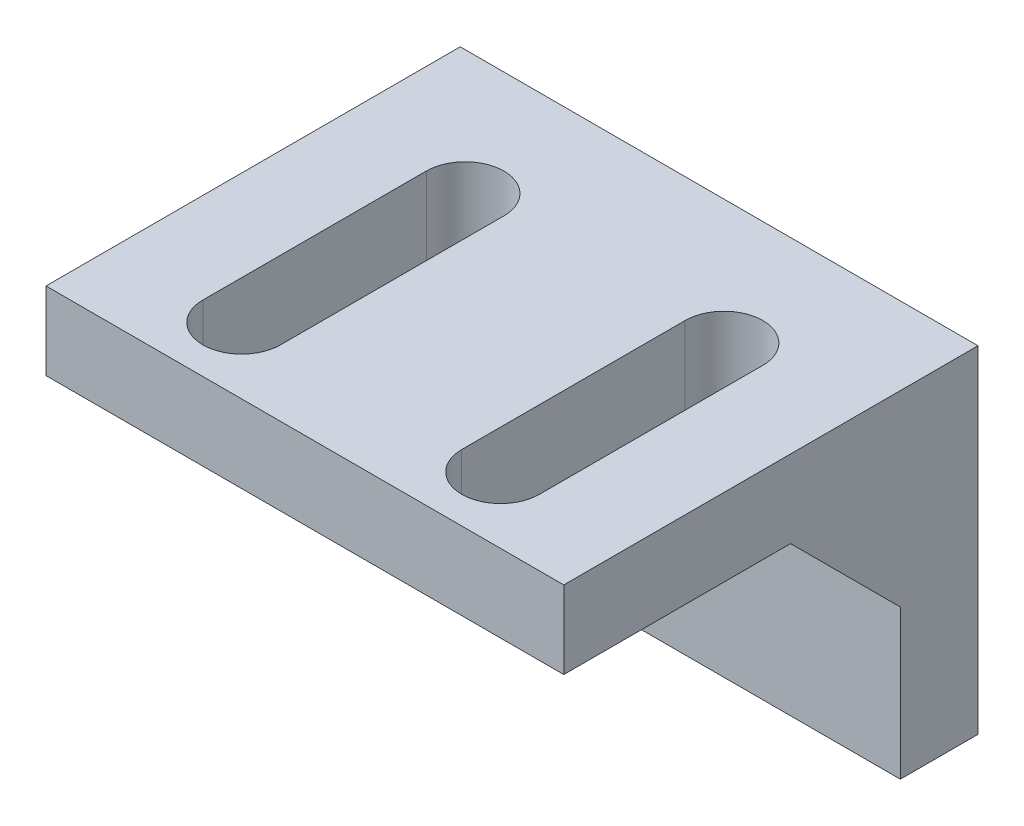
ISO-10303-21;
HEADER;
FILE_DESCRIPTION(('STEP AP214'),'2;1');
FILE_NAME('part.step','',(''),(''),'','','');
FILE_SCHEMA(('AUTOMOTIVE_DESIGN { 1 0 10303 214 1 1 1 1 }'));
ENDSEC;
DATA;
#1=APPLICATION_CONTEXT('core data for automotive mechanical design processes');
#2=APPLICATION_PROTOCOL_DEFINITION('international standard','automotive_design',2000,#1);
#3=PRODUCT_CONTEXT('',#1,'mechanical');
#4=PRODUCT('Part','Part','',(#3));
#5=PRODUCT_RELATED_PRODUCT_CATEGORY('part','',(#4));
#6=PRODUCT_DEFINITION_FORMATION('','',#4);
#7=PRODUCT_DEFINITION_CONTEXT('part definition',#1,'design');
#8=PRODUCT_DEFINITION('design','',#6,#7);
#9=PRODUCT_DEFINITION_SHAPE('','',#8);
#10=(LENGTH_UNIT() NAMED_UNIT(*) SI_UNIT(.MILLI.,.METRE.));
#11=(NAMED_UNIT(*) PLANE_ANGLE_UNIT() SI_UNIT($,.RADIAN.));
#12=(NAMED_UNIT(*) SI_UNIT($,.STERADIAN.) SOLID_ANGLE_UNIT());
#13=UNCERTAINTY_MEASURE_WITH_UNIT(LENGTH_MEASURE(1.E-05),#10,'distance_accuracy_value','');
#14=(GEOMETRIC_REPRESENTATION_CONTEXT(3) GLOBAL_UNCERTAINTY_ASSIGNED_CONTEXT((#13)) GLOBAL_UNIT_ASSIGNED_CONTEXT((#10,
#11,#12)) REPRESENTATION_CONTEXT('',''));
#15=CARTESIAN_POINT('',(0.,0.,0.));
#16=DIRECTION('',(0.,0.,1.));
#17=DIRECTION('',(1.,0.,0.));
#18=AXIS2_PLACEMENT_3D('',#15,#16,#17);
#19=CARTESIAN_POINT('',(14.8868315031985,-23.5550000000421,16.));
#20=DIRECTION('',(0.,1.,0.));
#21=DIRECTION('',(0.,0.,1.));
#22=AXIS2_PLACEMENT_3D('',#19,#20,#21);
#23=PLANE('',#22);
#24=DIRECTION('',(-1.,0.,0.));
#25=VECTOR('',#24,1.);
#26=CARTESIAN_POINT('',(17.8868315031985,-23.5550000000421,7.23913251133836));
#27=LINE('',#26,#25);
#28=CARTESIAN_POINT('',(17.8868315031985,-23.5550000000421,7.23913251133836));
#29=VERTEX_POINT('',#28);
#30=CARTESIAN_POINT('',(14.8868315031985,-23.5550000000421,7.23913251133836));
#31=VERTEX_POINT('',#30);
#32=EDGE_CURVE('E210',#29,#31,#27,.T.);
#33=ORIENTED_EDGE('',*,*,#32,.F.);
#34=DIRECTION('',(0.,-2.99782274259685E-10,1.));
#35=VECTOR('',#34,1.);
#36=CARTESIAN_POINT('',(17.8868315031985,-23.5549999987713,3.));
#37=LINE('',#36,#35);
#38=CARTESIAN_POINT('',(17.8868315031985,-23.5550000000421,3.));
#39=VERTEX_POINT('',#38);
#40=EDGE_CURVE('E198',#39,#29,#37,.T.);
#41=ORIENTED_EDGE('',*,*,#40,.F.);
#42=DIRECTION('',(1.,0.,0.));
#43=VECTOR('',#42,1.);
#44=CARTESIAN_POINT('',(14.8868315031985,-23.5550000000421,3.));
#45=LINE('',#44,#43);
#46=CARTESIAN_POINT('',(31.8868315031985,-23.5549999987713,3.));
#47=VERTEX_POINT('',#46);
#48=EDGE_CURVE('E260',#39,#47,#45,.T.);
#49=ORIENTED_EDGE('',*,*,#48,.T.);
#50=DIRECTION('',(0.,-2.99782274259685E-10,1.));
#51=VECTOR('',#50,1.);
#52=CARTESIAN_POINT('',(31.8868315031985,-23.5549999987713,3.));
#53=LINE('',#52,#51);
#54=CARTESIAN_POINT('',(31.8868315031985,-23.5550000000421,7.23913251133836));
#55=VERTEX_POINT('',#54);
#56=EDGE_CURVE('E247',#47,#55,#53,.T.);
#57=ORIENTED_EDGE('',*,*,#56,.T.);
#58=DIRECTION('',(1.,0.,0.));
#59=VECTOR('',#58,1.);
#60=CARTESIAN_POINT('',(31.8868315031985,-23.5550000000421,7.23913251133836));
#61=LINE('',#60,#59);
#62=CARTESIAN_POINT('',(34.8868315031985,-23.5550000000421,7.23913251133836));
#63=VERTEX_POINT('',#62);
#64=EDGE_CURVE('E255',#55,#63,#61,.T.);
#65=ORIENTED_EDGE('',*,*,#64,.T.);
#66=DIRECTION('',(0.,0.,-1.));
#67=VECTOR('',#66,1.);
#68=CARTESIAN_POINT('',(34.8868315031985,-23.5550000000421,16.));
#69=LINE('',#68,#67);
#70=CARTESIAN_POINT('',(34.8868315031985,-23.5550000000421,16.));
#71=VERTEX_POINT('',#70);
#72=EDGE_CURVE('E274',#71,#63,#69,.T.);
#73=ORIENTED_EDGE('',*,*,#72,.F.);
#74=DIRECTION('',(1.,0.,0.));
#75=VECTOR('',#74,1.);
#76=CARTESIAN_POINT('',(14.8868315031985,-23.5550000000421,16.));
#77=LINE('',#76,#75);
#78=CARTESIAN_POINT('',(14.8868315031985,-23.5550000000421,16.));
#79=VERTEX_POINT('',#78);
#80=EDGE_CURVE('E266',#79,#71,#77,.T.);
#81=ORIENTED_EDGE('',*,*,#80,.F.);
#82=DIRECTION('',(0.,0.,-1.));
#83=VECTOR('',#82,1.);
#84=CARTESIAN_POINT('',(14.8868315031985,-23.5550000000421,16.));
#85=LINE('',#84,#83);
#86=EDGE_CURVE('E292',#79,#31,#85,.T.);
#87=ORIENTED_EDGE('',*,*,#86,.T.);
#88=EDGE_LOOP('',(#33,#41,#49,#57,#65,#73,#81,#87));
#89=FACE_BOUND('',#88,.T.);
#90=CARTESIAN_POINT('',(29.8868315031985,-23.5550000000421,13.4411604619242));
#91=DIRECTION('',(0.,-1.,0.));
#92=DIRECTION('',(0.,0.,-1.));
#93=AXIS2_PLACEMENT_3D('',#90,#91,#92);
#94=CIRCLE('',#93,1.5);
#95=CARTESIAN_POINT('',(31.3868315031985,-23.5550000000421,13.4411604619242));
#96=VERTEX_POINT('',#95);
#97=CARTESIAN_POINT('',(28.3868315031985,-23.5550000000421,13.4411604619242));
#98=VERTEX_POINT('',#97);
#99=EDGE_CURVE('E230',#96,#98,#94,.T.);
#100=ORIENTED_EDGE('',*,*,#99,.F.);
#101=DIRECTION('',(0.,0.,1.));
#102=VECTOR('',#101,1.);
#103=CARTESIAN_POINT('',(31.3868315031985,-23.5550000000421,4.81211077924535));
#104=LINE('',#103,#102);
#105=CARTESIAN_POINT('',(31.3868315031985,-23.5550000000421,4.81211077924535));
#106=VERTEX_POINT('',#105);
#107=EDGE_CURVE('E213',#106,#96,#104,.T.);
#108=ORIENTED_EDGE('',*,*,#107,.F.);
#109=CARTESIAN_POINT('',(29.8868315031985,-23.5550000000421,4.81211077924535));
#110=DIRECTION('',(0.,-1.,0.));
#111=DIRECTION('',(0.,0.,-1.));
#112=AXIS2_PLACEMENT_3D('',#109,#110,#111);
#113=CIRCLE('',#112,1.5);
#114=CARTESIAN_POINT('',(28.3868315031985,-23.5550000000421,4.81211077924535));
#115=VERTEX_POINT('',#114);
#116=EDGE_CURVE('E219',#115,#106,#113,.T.);
#117=ORIENTED_EDGE('',*,*,#116,.F.);
#118=DIRECTION('',(0.,0.,1.));
#119=VECTOR('',#118,1.);
#120=CARTESIAN_POINT('',(28.3868315031985,-23.5550000000421,4.81211077924535));
#121=LINE('',#120,#119);
#122=EDGE_CURVE('E233',#115,#98,#121,.T.);
#123=ORIENTED_EDGE('',*,*,#122,.T.);
#124=EDGE_LOOP('',(#100,#108,#117,#123));
#125=FACE_BOUND('',#124,.T.);
#126=DIRECTION('',(0.,0.,1.));
#127=VECTOR('',#126,1.);
#128=CARTESIAN_POINT('',(18.3868315031985,-23.5550000000421,4.81211077924535));
#129=LINE('',#128,#127);
#130=CARTESIAN_POINT('',(18.3868315031985,-23.5550000000421,4.81211077924535));
#131=VERTEX_POINT('',#130);
#132=CARTESIAN_POINT('',(18.3868315031985,-23.5550000000421,13.4411604619242));
#133=VERTEX_POINT('',#132);
#134=EDGE_CURVE('E51',#131,#133,#129,.T.);
#135=ORIENTED_EDGE('',*,*,#134,.T.);
#136=CARTESIAN_POINT('',(19.8868315031985,-23.5550000000421,13.4411604619242));
#137=DIRECTION('',(0.,1.,0.));
#138=DIRECTION('',(0.,0.,-1.));
#139=AXIS2_PLACEMENT_3D('',#136,#137,#138);
#140=CIRCLE('',#139,1.5);
#141=CARTESIAN_POINT('',(21.3868315031985,-23.5550000000421,13.4411604619242));
#142=VERTEX_POINT('',#141);
#143=EDGE_CURVE('E179',#133,#142,#140,.T.);
#144=ORIENTED_EDGE('',*,*,#143,.T.);
#145=DIRECTION('',(0.,0.,1.));
#146=VECTOR('',#145,1.);
#147=CARTESIAN_POINT('',(21.3868315031985,-23.5550000000421,4.81211077924535));
#148=LINE('',#147,#146);
#149=CARTESIAN_POINT('',(21.3868315031985,-23.5550000000421,4.81211077924535));
#150=VERTEX_POINT('',#149);
#151=EDGE_CURVE('E182',#150,#142,#148,.T.);
#152=ORIENTED_EDGE('',*,*,#151,.F.);
#153=CARTESIAN_POINT('',(19.8868315031985,-23.5550000000421,4.81211077924535));
#154=DIRECTION('',(0.,1.,0.));
#155=DIRECTION('',(0.,0.,-1.));
#156=AXIS2_PLACEMENT_3D('',#153,#154,#155);
#157=CIRCLE('',#156,1.5);
#158=EDGE_CURVE('E188',#150,#131,#157,.T.);
#159=ORIENTED_EDGE('',*,*,#158,.T.);
#160=EDGE_LOOP('',(#135,#144,#152,#159));
#161=FACE_BOUND('',#160,.T.);
#162=ADVANCED_FACE('F33',(#89,#125,#161),#23,.F.);
#163=CARTESIAN_POINT('',(14.8868315031985,-20.5550000000421,3.));
#164=DIRECTION('',(0.,1.,0.));
#165=DIRECTION('',(0.,0.,1.));
#166=AXIS2_PLACEMENT_3D('',#163,#164,#165);
#167=PLANE('',#166);
#168=DIRECTION('',(1.,0.,0.));
#169=VECTOR('',#168,1.);
#170=CARTESIAN_POINT('',(14.8868315031985,-20.5550000000421,0.));
#171=LINE('',#170,#169);
#172=CARTESIAN_POINT('',(14.8868315031985,-20.5550000000421,0.));
#173=VERTEX_POINT('',#172);
#174=CARTESIAN_POINT('',(34.8868315031985,-20.5550000000421,0.));
#175=VERTEX_POINT('',#174);
#176=EDGE_CURVE('E298',#173,#175,#171,.T.);
#177=ORIENTED_EDGE('',*,*,#176,.F.);
#178=DIRECTION('',(0.,0.,-1.));
#179=VECTOR('',#178,1.);
#180=CARTESIAN_POINT('',(14.8868315031985,-20.5550000000421,3.));
#181=LINE('',#180,#179);
#182=CARTESIAN_POINT('',(14.8868315031985,-20.5550000000421,16.));
#183=VERTEX_POINT('',#182);
#184=EDGE_CURVE('E282',#183,#173,#181,.T.);
#185=ORIENTED_EDGE('',*,*,#184,.F.);
#186=DIRECTION('',(-1.,0.,0.));
#187=VECTOR('',#186,1.);
#188=CARTESIAN_POINT('',(14.8868315031985,-20.5550000000421,16.));
#189=LINE('',#188,#187);
#190=CARTESIAN_POINT('',(34.8868315031985,-20.5550000000421,16.));
#191=VERTEX_POINT('',#190);
#192=EDGE_CURVE('E271',#191,#183,#189,.T.);
#193=ORIENTED_EDGE('',*,*,#192,.F.);
#194=DIRECTION('',(0.,0.,-1.));
#195=VECTOR('',#194,1.);
#196=CARTESIAN_POINT('',(34.8868315031985,-20.5550000000421,3.));
#197=LINE('',#196,#195);
#198=EDGE_CURVE('E302',#191,#175,#197,.T.);
#199=ORIENTED_EDGE('',*,*,#198,.T.);
#200=EDGE_LOOP('',(#177,#185,#193,#199));
#201=FACE_BOUND('',#200,.T.);
#202=DIRECTION('',(0.,0.,1.));
#203=VECTOR('',#202,1.);
#204=CARTESIAN_POINT('',(31.3868315031985,-20.5550000000421,4.81211077924535));
#205=LINE('',#204,#203);
#206=CARTESIAN_POINT('',(31.3868315031985,-20.5550000000421,4.81211077924535));
#207=VERTEX_POINT('',#206);
#208=CARTESIAN_POINT('',(31.3868315031985,-20.5550000000421,13.4411604619242));
#209=VERTEX_POINT('',#208);
#210=EDGE_CURVE('E215',#207,#209,#205,.T.);
#211=ORIENTED_EDGE('',*,*,#210,.T.);
#212=CARTESIAN_POINT('',(29.8868315031985,-20.5550000000421,13.4411604619242));
#213=DIRECTION('',(0.,-1.,0.));
#214=DIRECTION('',(0.,0.,-1.));
#215=AXIS2_PLACEMENT_3D('',#212,#213,#214);
#216=CIRCLE('',#215,1.5);
#217=CARTESIAN_POINT('',(28.3868315031985,-20.5550000000421,13.4411604619242));
#218=VERTEX_POINT('',#217);
#219=EDGE_CURVE('E218',#209,#218,#216,.T.);
#220=ORIENTED_EDGE('',*,*,#219,.T.);
#221=DIRECTION('',(0.,0.,1.));
#222=VECTOR('',#221,1.);
#223=CARTESIAN_POINT('',(28.3868315031985,-20.5550000000421,4.81211077924535));
#224=LINE('',#223,#222);
#225=CARTESIAN_POINT('',(28.3868315031985,-20.5550000000421,4.81211077924535));
#226=VERTEX_POINT('',#225);
#227=EDGE_CURVE('E222',#226,#218,#224,.T.);
#228=ORIENTED_EDGE('',*,*,#227,.F.);
#229=CARTESIAN_POINT('',(29.8868315031985,-20.5550000000421,4.81211077924535));
#230=DIRECTION('',(0.,-1.,0.));
#231=DIRECTION('',(0.,0.,-1.));
#232=AXIS2_PLACEMENT_3D('',#229,#230,#231);
#233=CIRCLE('',#232,1.5);
#234=EDGE_CURVE('E225',#226,#207,#233,.T.);
#235=ORIENTED_EDGE('',*,*,#234,.T.);
#236=EDGE_LOOP('',(#211,#220,#228,#235));
#237=FACE_BOUND('',#236,.T.);
#238=CARTESIAN_POINT('',(19.8868315031985,-20.5550000000421,13.4411604619242));
#239=DIRECTION('',(0.,1.,0.));
#240=DIRECTION('',(0.,0.,-1.));
#241=AXIS2_PLACEMENT_3D('',#238,#239,#240);
#242=CIRCLE('',#241,1.5);
#243=CARTESIAN_POINT('',(18.3868315031985,-20.5550000000421,13.4411604619242));
#244=VERTEX_POINT('',#243);
#245=CARTESIAN_POINT('',(21.3868315031985,-20.5550000000421,13.4411604619242));
#246=VERTEX_POINT('',#245);
#247=EDGE_CURVE('E175',#244,#246,#242,.T.);
#248=ORIENTED_EDGE('',*,*,#247,.F.);
#249=DIRECTION('',(0.,0.,1.));
#250=VECTOR('',#249,1.);
#251=CARTESIAN_POINT('',(18.3868315031985,-20.5550000000421,4.81211077924535));
#252=LINE('',#251,#250);
#253=CARTESIAN_POINT('',(18.3868315031985,-20.5550000000421,4.81211077924535));
#254=VERTEX_POINT('',#253);
#255=EDGE_CURVE('E171',#254,#244,#252,.T.);
#256=ORIENTED_EDGE('',*,*,#255,.F.);
#257=CARTESIAN_POINT('',(19.8868315031985,-20.5550000000421,4.81211077924535));
#258=DIRECTION('',(0.,1.,0.));
#259=DIRECTION('',(0.,0.,-1.));
#260=AXIS2_PLACEMENT_3D('',#257,#258,#259);
#261=CIRCLE('',#260,1.5);
#262=CARTESIAN_POINT('',(21.3868315031985,-20.5550000000421,4.81211077924535));
#263=VERTEX_POINT('',#262);
#264=EDGE_CURVE('E163',#263,#254,#261,.T.);
#265=ORIENTED_EDGE('',*,*,#264,.F.);
#266=DIRECTION('',(0.,0.,1.));
#267=VECTOR('',#266,1.);
#268=CARTESIAN_POINT('',(21.3868315031985,-20.5550000000421,4.81211077924535));
#269=LINE('',#268,#267);
#270=EDGE_CURVE('E59',#263,#246,#269,.T.);
#271=ORIENTED_EDGE('',*,*,#270,.T.);
#272=EDGE_LOOP('',(#248,#256,#265,#271));
#273=FACE_BOUND('',#272,.T.);
#274=ADVANCED_FACE('F178',(#201,#237,#273),#167,.T.);
#275=CARTESIAN_POINT('',(0.,0.,3.));
#276=DIRECTION('',(0.,0.,1.));
#277=DIRECTION('',(1.,0.,0.));
#278=AXIS2_PLACEMENT_3D('',#275,#276,#277);
#279=PLANE('',#278);
#280=DIRECTION('',(0.,1.,0.));
#281=VECTOR('',#280,1.);
#282=CARTESIAN_POINT('',(17.8868315031985,-27.7941325101097,3.));
#283=LINE('',#282,#281);
#284=CARTESIAN_POINT('',(17.8868315031985,-27.7941325101097,3.));
#285=VERTEX_POINT('',#284);
#286=EDGE_CURVE('E201',#285,#39,#283,.T.);
#287=ORIENTED_EDGE('',*,*,#286,.F.);
#288=DIRECTION('',(-1.,0.,0.));
#289=VECTOR('',#288,1.);
#290=CARTESIAN_POINT('',(17.8868315031985,-27.7941325101097,3.));
#291=LINE('',#290,#289);
#292=CARTESIAN_POINT('',(14.8868315031985,-27.7941325101096,3.));
#293=VERTEX_POINT('',#292);
#294=EDGE_CURVE('E207',#285,#293,#291,.T.);
#295=ORIENTED_EDGE('',*,*,#294,.T.);
#296=DIRECTION('',(0.,-1.,0.));
#297=VECTOR('',#296,1.);
#298=CARTESIAN_POINT('',(14.8868315031985,-20.5550000000421,3.));
#299=LINE('',#298,#297);
#300=CARTESIAN_POINT('',(14.8868315031985,-33.5550000000421,3.));
#301=VERTEX_POINT('',#300);
#302=EDGE_CURVE('E37',#293,#301,#299,.T.);
#303=ORIENTED_EDGE('',*,*,#302,.T.);
#304=DIRECTION('',(1.,0.,0.));
#305=VECTOR('',#304,1.);
#306=CARTESIAN_POINT('',(14.8868315031985,-33.5550000000421,3.));
#307=LINE('',#306,#305);
#308=CARTESIAN_POINT('',(34.8868315031985,-33.5550000000421,3.));
#309=VERTEX_POINT('',#308);
#310=EDGE_CURVE('E283',#301,#309,#307,.T.);
#311=ORIENTED_EDGE('',*,*,#310,.T.);
#312=DIRECTION('',(0.,-1.,0.));
#313=VECTOR('',#312,1.);
#314=CARTESIAN_POINT('',(34.8868315031985,-20.5550000000421,3.));
#315=LINE('',#314,#313);
#316=CARTESIAN_POINT('',(34.8868315031985,-27.7941325101096,3.));
#317=VERTEX_POINT('',#316);
#318=EDGE_CURVE('E279',#317,#309,#315,.T.);
#319=ORIENTED_EDGE('',*,*,#318,.F.);
#320=DIRECTION('',(1.,0.,0.));
#321=VECTOR('',#320,1.);
#322=CARTESIAN_POINT('',(31.8868315031985,-27.7941325101096,3.));
#323=LINE('',#322,#321);
#324=CARTESIAN_POINT('',(31.8868315031985,-27.7941325101096,3.));
#325=VERTEX_POINT('',#324);
#326=EDGE_CURVE('E258',#325,#317,#323,.T.);
#327=ORIENTED_EDGE('',*,*,#326,.F.);
#328=DIRECTION('',(0.,1.,0.));
#329=VECTOR('',#328,1.);
#330=CARTESIAN_POINT('',(31.8868315031985,-27.7941325101096,3.));
#331=LINE('',#330,#329);
#332=EDGE_CURVE('E252',#325,#47,#331,.T.);
#333=ORIENTED_EDGE('',*,*,#332,.T.);
#334=ORIENTED_EDGE('',*,*,#48,.F.);
#335=EDGE_LOOP('',(#287,#295,#303,#311,#319,#327,#333,#334));
#336=FACE_BOUND('',#335,.T.);
#337=ADVANCED_FACE('F326',(#336),#279,.T.);
#338=CARTESIAN_POINT('',(14.8868315031985,-20.5550000000421,3.));
#339=DIRECTION('',(1.,0.,0.));
#340=DIRECTION('',(0.,1.,0.));
#341=AXIS2_PLACEMENT_3D('',#338,#339,#340);
#342=PLANE('',#341);
#343=ORIENTED_EDGE('',*,*,#302,.F.);
#344=DIRECTION('',(0.,-0.707106781080558,-0.707106781292537));
#345=VECTOR('',#344,1.);
#346=CARTESIAN_POINT('',(14.8868315031985,-23.5550000000421,7.23913251133836));
#347=LINE('',#346,#345);
#348=EDGE_CURVE('E194',#31,#293,#347,.T.);
#349=ORIENTED_EDGE('',*,*,#348,.F.);
#350=ORIENTED_EDGE('',*,*,#86,.F.);
#351=DIRECTION('',(0.,-1.,0.));
#352=VECTOR('',#351,1.);
#353=CARTESIAN_POINT('',(14.8868315031985,-20.5550000000421,16.));
#354=LINE('',#353,#352);
#355=EDGE_CURVE('E263',#183,#79,#354,.T.);
#356=ORIENTED_EDGE('',*,*,#355,.F.);
#357=ORIENTED_EDGE('',*,*,#184,.T.);
#358=DIRECTION('',(0.,-1.,0.));
#359=VECTOR('',#358,1.);
#360=CARTESIAN_POINT('',(14.8868315031985,-20.5550000000421,0.));
#361=LINE('',#360,#359);
#362=CARTESIAN_POINT('',(14.8868315031985,-33.5550000000421,0.));
#363=VERTEX_POINT('',#362);
#364=EDGE_CURVE('E288',#173,#363,#361,.T.);
#365=ORIENTED_EDGE('',*,*,#364,.T.);
#366=DIRECTION('',(0.,0.,-1.));
#367=VECTOR('',#366,1.);
#368=CARTESIAN_POINT('',(14.8868315031985,-33.5550000000421,3.));
#369=LINE('',#368,#367);
#370=EDGE_CURVE('E11',#301,#363,#369,.T.);
#371=ORIENTED_EDGE('',*,*,#370,.F.);
#372=EDGE_LOOP('',(#343,#349,#350,#356,#357,#365,#371));
#373=FACE_BOUND('',#372,.T.);
#374=ADVANCED_FACE('F35',(#373),#342,.F.);
#375=CARTESIAN_POINT('',(14.8868315031985,-33.5550000000421,3.));
#376=DIRECTION('',(0.,1.,0.));
#377=DIRECTION('',(0.,0.,1.));
#378=AXIS2_PLACEMENT_3D('',#375,#376,#377);
#379=PLANE('',#378);
#380=DIRECTION('',(1.,0.,0.));
#381=VECTOR('',#380,1.);
#382=CARTESIAN_POINT('',(14.8868315031985,-33.5550000000421,0.));
#383=LINE('',#382,#381);
#384=CARTESIAN_POINT('',(34.8868315031985,-33.5550000000421,0.));
#385=VERTEX_POINT('',#384);
#386=EDGE_CURVE('E291',#363,#385,#383,.T.);
#387=ORIENTED_EDGE('',*,*,#386,.T.);
#388=DIRECTION('',(0.,0.,-1.));
#389=VECTOR('',#388,1.);
#390=CARTESIAN_POINT('',(34.8868315031985,-33.5550000000421,3.));
#391=LINE('',#390,#389);
#392=EDGE_CURVE('E43',#309,#385,#391,.T.);
#393=ORIENTED_EDGE('',*,*,#392,.F.);
#394=ORIENTED_EDGE('',*,*,#310,.F.);
#395=ORIENTED_EDGE('',*,*,#370,.T.);
#396=EDGE_LOOP('',(#387,#393,#394,#395));
#397=FACE_BOUND('',#396,.T.);
#398=ADVANCED_FACE('F350',(#397),#379,.F.);
#399=CARTESIAN_POINT('',(34.8868315031985,-20.5550000000421,3.));
#400=DIRECTION('',(1.,0.,0.));
#401=DIRECTION('',(0.,0.,-1.));
#402=AXIS2_PLACEMENT_3D('',#399,#400,#401);
#403=PLANE('',#402);
#404=DIRECTION('',(0.,-0.707106781080558,-0.707106781292537));
#405=VECTOR('',#404,1.);
#406=CARTESIAN_POINT('',(34.8868315031985,-23.5550000000421,7.23913251133836));
#407=LINE('',#406,#405);
#408=EDGE_CURVE('E240',#63,#317,#407,.T.);
#409=ORIENTED_EDGE('',*,*,#408,.T.);
#410=ORIENTED_EDGE('',*,*,#318,.T.);
#411=ORIENTED_EDGE('',*,*,#392,.T.);
#412=DIRECTION('',(0.,-1.,0.));
#413=VECTOR('',#412,1.);
#414=CARTESIAN_POINT('',(34.8868315031985,-20.5550000000421,0.));
#415=LINE('',#414,#413);
#416=EDGE_CURVE('E295',#175,#385,#415,.T.);
#417=ORIENTED_EDGE('',*,*,#416,.F.);
#418=ORIENTED_EDGE('',*,*,#198,.F.);
#419=DIRECTION('',(0.,1.,0.));
#420=VECTOR('',#419,1.);
#421=CARTESIAN_POINT('',(34.8868315031985,-20.5550000000421,16.));
#422=LINE('',#421,#420);
#423=EDGE_CURVE('E268',#71,#191,#422,.T.);
#424=ORIENTED_EDGE('',*,*,#423,.F.);
#425=ORIENTED_EDGE('',*,*,#72,.T.);
#426=EDGE_LOOP('',(#409,#410,#411,#417,#418,#424,#425));
#427=FACE_BOUND('',#426,.T.);
#428=ADVANCED_FACE('F336',(#427),#403,.T.);
#429=CARTESIAN_POINT('',(0.,0.,0.));
#430=DIRECTION('',(0.,0.,1.));
#431=DIRECTION('',(1.,0.,0.));
#432=AXIS2_PLACEMENT_3D('',#429,#430,#431);
#433=PLANE('',#432);
#434=ORIENTED_EDGE('',*,*,#364,.F.);
#435=ORIENTED_EDGE('',*,*,#176,.T.);
#436=ORIENTED_EDGE('',*,*,#416,.T.);
#437=ORIENTED_EDGE('',*,*,#386,.F.);
#438=EDGE_LOOP('',(#434,#435,#436,#437));
#439=FACE_BOUND('',#438,.T.);
#440=ADVANCED_FACE('F346',(#439),#433,.F.);
#441=CARTESIAN_POINT('',(0.,0.,16.));
#442=DIRECTION('',(0.,0.,1.));
#443=DIRECTION('',(1.,0.,0.));
#444=AXIS2_PLACEMENT_3D('',#441,#442,#443);
#445=PLANE('',#444);
#446=ORIENTED_EDGE('',*,*,#355,.T.);
#447=ORIENTED_EDGE('',*,*,#80,.T.);
#448=ORIENTED_EDGE('',*,*,#423,.T.);
#449=ORIENTED_EDGE('',*,*,#192,.T.);
#450=EDGE_LOOP('',(#446,#447,#448,#449));
#451=FACE_BOUND('',#450,.T.);
#452=ADVANCED_FACE('F340',(#451),#445,.T.);
#453=CARTESIAN_POINT('',(31.8868315031985,-23.5550000000421,7.23913251133836));
#454=DIRECTION('',(0.,-0.707106781292536,0.707106781080558));
#455=DIRECTION('',(0.,-0.707106781080558,-0.707106781292537));
#456=AXIS2_PLACEMENT_3D('',#453,#454,#455);
#457=PLANE('',#456);
#458=ORIENTED_EDGE('',*,*,#408,.F.);
#459=ORIENTED_EDGE('',*,*,#64,.F.);
#460=DIRECTION('',(0.,-0.707106781080558,-0.707106781292537));
#461=VECTOR('',#460,1.);
#462=CARTESIAN_POINT('',(31.8868315031985,-23.5550000000421,7.23913251133836));
#463=LINE('',#462,#461);
#464=EDGE_CURVE('E250',#55,#325,#463,.T.);
#465=ORIENTED_EDGE('',*,*,#464,.T.);
#466=ORIENTED_EDGE('',*,*,#326,.T.);
#467=EDGE_LOOP('',(#458,#459,#465,#466));
#468=FACE_BOUND('',#467,.T.);
#469=ADVANCED_FACE('F373',(#468),#457,.T.);
#470=CARTESIAN_POINT('',(31.8868315031985,0.,0.));
#471=DIRECTION('',(-1.,0.,0.));
#472=DIRECTION('',(0.,0.,1.));
#473=AXIS2_PLACEMENT_3D('',#470,#471,#472);
#474=PLANE('',#473);
#475=ORIENTED_EDGE('',*,*,#56,.F.);
#476=ORIENTED_EDGE('',*,*,#332,.F.);
#477=ORIENTED_EDGE('',*,*,#464,.F.);
#478=EDGE_LOOP('',(#475,#476,#477));
#479=FACE_BOUND('',#478,.T.);
#480=ADVANCED_FACE('F332',(#479),#474,.T.);
#481=CARTESIAN_POINT('',(31.3868315031985,-20.5550000000421,4.81211077924535));
#482=DIRECTION('',(1.,0.,0.));
#483=DIRECTION('',(0.,0.,-1.));
#484=AXIS2_PLACEMENT_3D('',#481,#482,#483);
#485=PLANE('',#484);
#486=ORIENTED_EDGE('',*,*,#107,.T.);
#487=DIRECTION('',(0.,-1.,0.));
#488=VECTOR('',#487,1.);
#489=CARTESIAN_POINT('',(31.3868315031985,-20.5550000000421,13.4411604619242));
#490=LINE('',#489,#488);
#491=EDGE_CURVE('E228',#209,#96,#490,.T.);
#492=ORIENTED_EDGE('',*,*,#491,.F.);
#493=ORIENTED_EDGE('',*,*,#210,.F.);
#494=DIRECTION('',(0.,-1.,0.));
#495=VECTOR('',#494,1.);
#496=CARTESIAN_POINT('',(31.3868315031985,-20.5550000000421,4.81211077924535));
#497=LINE('',#496,#495);
#498=EDGE_CURVE('E238',#207,#106,#497,.T.);
#499=ORIENTED_EDGE('',*,*,#498,.T.);
#500=EDGE_LOOP('',(#486,#492,#493,#499));
#501=FACE_BOUND('',#500,.T.);
#502=ADVANCED_FACE('F380',(#501),#485,.F.);
#503=CARTESIAN_POINT('',(29.8868315031985,-20.5550000000421,4.81211077924535));
#504=DIRECTION('',(0.,-1.,0.));
#505=DIRECTION('',(0.,0.,-1.));
#506=AXIS2_PLACEMENT_3D('',#503,#504,#505);
#507=CYLINDRICAL_SURFACE('',#506,1.5);
#508=ORIENTED_EDGE('',*,*,#116,.T.);
#509=ORIENTED_EDGE('',*,*,#498,.F.);
#510=ORIENTED_EDGE('',*,*,#234,.F.);
#511=DIRECTION('',(0.,-1.,0.));
#512=VECTOR('',#511,1.);
#513=CARTESIAN_POINT('',(28.3868315031985,-20.5550000000421,4.81211077924535));
#514=LINE('',#513,#512);
#515=EDGE_CURVE('E241',#226,#115,#514,.T.);
#516=ORIENTED_EDGE('',*,*,#515,.T.);
#517=EDGE_LOOP('',(#508,#509,#510,#516));
#518=FACE_BOUND('',#517,.T.);
#519=ADVANCED_FACE('F385',(#518),#507,.F.);
#520=CARTESIAN_POINT('',(28.3868315031985,-20.5550000000421,4.81211077924535));
#521=DIRECTION('',(1.,0.,0.));
#522=DIRECTION('',(0.,0.,-1.));
#523=AXIS2_PLACEMENT_3D('',#520,#521,#522);
#524=PLANE('',#523);
#525=ORIENTED_EDGE('',*,*,#122,.F.);
#526=ORIENTED_EDGE('',*,*,#515,.F.);
#527=ORIENTED_EDGE('',*,*,#227,.T.);
#528=DIRECTION('',(0.,-1.,0.));
#529=VECTOR('',#528,1.);
#530=CARTESIAN_POINT('',(28.3868315031985,-20.5550000000421,13.4411604619242));
#531=LINE('',#530,#529);
#532=EDGE_CURVE('E243',#218,#98,#531,.T.);
#533=ORIENTED_EDGE('',*,*,#532,.T.);
#534=EDGE_LOOP('',(#525,#526,#527,#533));
#535=FACE_BOUND('',#534,.T.);
#536=ADVANCED_FACE('F390',(#535),#524,.T.);
#537=CARTESIAN_POINT('',(29.8868315031985,-20.5550000000421,13.4411604619242));
#538=DIRECTION('',(0.,-1.,0.));
#539=DIRECTION('',(0.,0.,-1.));
#540=AXIS2_PLACEMENT_3D('',#537,#538,#539);
#541=CYLINDRICAL_SURFACE('',#540,1.5);
#542=ORIENTED_EDGE('',*,*,#99,.T.);
#543=ORIENTED_EDGE('',*,*,#532,.F.);
#544=ORIENTED_EDGE('',*,*,#219,.F.);
#545=ORIENTED_EDGE('',*,*,#491,.T.);
#546=EDGE_LOOP('',(#542,#543,#544,#545));
#547=FACE_BOUND('',#546,.T.);
#548=ADVANCED_FACE('F387',(#547),#541,.F.);
#549=CARTESIAN_POINT('',(17.8868315031985,-23.5550000000421,7.23913251133836));
#550=DIRECTION('',(0.,0.707106781292536,-0.707106781080558));
#551=DIRECTION('',(0.,0.707106781080558,0.707106781292537));
#552=AXIS2_PLACEMENT_3D('',#549,#550,#551);
#553=PLANE('',#552);
#554=ORIENTED_EDGE('',*,*,#348,.T.);
#555=ORIENTED_EDGE('',*,*,#294,.F.);
#556=DIRECTION('',(0.,-0.707106781080558,-0.707106781292537));
#557=VECTOR('',#556,1.);
#558=CARTESIAN_POINT('',(17.8868315031985,-23.5550000000421,7.23913251133836));
#559=LINE('',#558,#557);
#560=EDGE_CURVE('E204',#29,#285,#559,.T.);
#561=ORIENTED_EDGE('',*,*,#560,.F.);
#562=ORIENTED_EDGE('',*,*,#32,.T.);
#563=EDGE_LOOP('',(#554,#555,#561,#562));
#564=FACE_BOUND('',#563,.T.);
#565=ADVANCED_FACE('F320',(#564),#553,.F.);
#566=CARTESIAN_POINT('',(17.8868315031985,0.,0.));
#567=DIRECTION('',(1.,0.,0.));
#568=DIRECTION('',(0.,0.,1.));
#569=AXIS2_PLACEMENT_3D('',#566,#567,#568);
#570=PLANE('',#569);
#571=ORIENTED_EDGE('',*,*,#40,.T.);
#572=ORIENTED_EDGE('',*,*,#560,.T.);
#573=ORIENTED_EDGE('',*,*,#286,.T.);
#574=EDGE_LOOP('',(#571,#572,#573));
#575=FACE_BOUND('',#574,.T.);
#576=ADVANCED_FACE('F322',(#575),#570,.T.);
#577=CARTESIAN_POINT('',(18.3868315031985,-20.5550000000421,4.81211077924535));
#578=DIRECTION('',(1.,0.,0.));
#579=DIRECTION('',(0.,1.,0.));
#580=AXIS2_PLACEMENT_3D('',#577,#578,#579);
#581=PLANE('',#580);
#582=ORIENTED_EDGE('',*,*,#134,.F.);
#583=DIRECTION('',(0.,-1.,0.));
#584=VECTOR('',#583,1.);
#585=CARTESIAN_POINT('',(18.3868315031985,-20.5550000000421,4.81211077924535));
#586=LINE('',#585,#584);
#587=EDGE_CURVE('E166',#254,#131,#586,.T.);
#588=ORIENTED_EDGE('',*,*,#587,.F.);
#589=ORIENTED_EDGE('',*,*,#255,.T.);
#590=DIRECTION('',(0.,-1.,0.));
#591=VECTOR('',#590,1.);
#592=CARTESIAN_POINT('',(18.3868315031985,-20.5550000000421,13.4411604619242));
#593=LINE('',#592,#591);
#594=EDGE_CURVE('E192',#244,#133,#593,.T.);
#595=ORIENTED_EDGE('',*,*,#594,.T.);
#596=EDGE_LOOP('',(#582,#588,#589,#595));
#597=FACE_BOUND('',#596,.T.);
#598=ADVANCED_FACE('F173',(#597),#581,.T.);
#599=CARTESIAN_POINT('',(19.8868315031985,-20.5550000000421,13.4411604619242));
#600=DIRECTION('',(0.,-1.,0.));
#601=DIRECTION('',(1.,0.,0.));
#602=AXIS2_PLACEMENT_3D('',#599,#600,#601);
#603=CYLINDRICAL_SURFACE('',#602,1.5);
#604=ORIENTED_EDGE('',*,*,#143,.F.);
#605=ORIENTED_EDGE('',*,*,#594,.F.);
#606=ORIENTED_EDGE('',*,*,#247,.T.);
#607=DIRECTION('',(0.,-1.,0.));
#608=VECTOR('',#607,1.);
#609=CARTESIAN_POINT('',(21.3868315031985,-20.5550000000421,13.4411604619242));
#610=LINE('',#609,#608);
#611=EDGE_CURVE('E195',#246,#142,#610,.T.);
#612=ORIENTED_EDGE('',*,*,#611,.T.);
#613=EDGE_LOOP('',(#604,#605,#606,#612));
#614=FACE_BOUND('',#613,.T.);
#615=ADVANCED_FACE('F404',(#614),#603,.F.);
#616=CARTESIAN_POINT('',(21.3868315031985,-20.5550000000421,4.81211077924535));
#617=DIRECTION('',(1.,0.,0.));
#618=DIRECTION('',(0.,1.,0.));
#619=AXIS2_PLACEMENT_3D('',#616,#617,#618);
#620=PLANE('',#619);
#621=ORIENTED_EDGE('',*,*,#151,.T.);
#622=ORIENTED_EDGE('',*,*,#611,.F.);
#623=ORIENTED_EDGE('',*,*,#270,.F.);
#624=DIRECTION('',(0.,-1.,0.));
#625=VECTOR('',#624,1.);
#626=CARTESIAN_POINT('',(21.3868315031985,-20.5550000000421,4.81211077924535));
#627=LINE('',#626,#625);
#628=EDGE_CURVE('E168',#263,#150,#627,.T.);
#629=ORIENTED_EDGE('',*,*,#628,.T.);
#630=EDGE_LOOP('',(#621,#622,#623,#629));
#631=FACE_BOUND('',#630,.T.);
#632=ADVANCED_FACE('F407',(#631),#620,.F.);
#633=CARTESIAN_POINT('',(19.8868315031985,-20.5550000000421,4.81211077924535));
#634=DIRECTION('',(0.,-1.,0.));
#635=DIRECTION('',(1.,0.,0.));
#636=AXIS2_PLACEMENT_3D('',#633,#634,#635);
#637=CYLINDRICAL_SURFACE('',#636,1.5);
#638=ORIENTED_EDGE('',*,*,#158,.F.);
#639=ORIENTED_EDGE('',*,*,#628,.F.);
#640=ORIENTED_EDGE('',*,*,#264,.T.);
#641=ORIENTED_EDGE('',*,*,#587,.T.);
#642=EDGE_LOOP('',(#638,#639,#640,#641));
#643=FACE_BOUND('',#642,.T.);
#644=ADVANCED_FACE('F165',(#643),#637,.F.);
#645=CLOSED_SHELL('',(#162,#274,#337,#374,#398,#428,#440,#452,#469,#480,#502,#519,#536,#548,
#565,#576,#598,#615,#632,#644));
#646=MANIFOLD_SOLID_BREP('B2',#645);
#647=ADVANCED_BREP_SHAPE_REPRESENTATION('',(#18,#646),#14);
#648=SHAPE_DEFINITION_REPRESENTATION(#9,#647);
ENDSEC;
END-ISO-10303-21;
